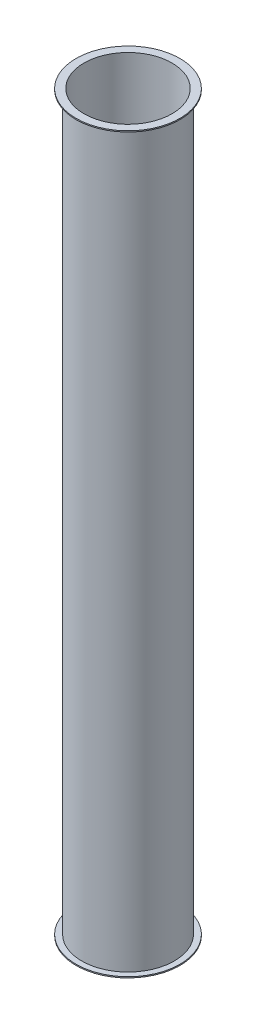
ISO-10303-21;
HEADER;
FILE_DESCRIPTION(('STEP AP214'),'2;1');
FILE_NAME('part.step','',(''),(''),'','','');
FILE_SCHEMA(('AUTOMOTIVE_DESIGN { 1 0 10303 214 1 1 1 1 }'));
ENDSEC;
DATA;
#1=APPLICATION_CONTEXT('core data for automotive mechanical design processes');
#2=APPLICATION_PROTOCOL_DEFINITION('international standard','automotive_design',2000,#1);
#3=PRODUCT_CONTEXT('',#1,'mechanical');
#4=PRODUCT('Part','Part','',(#3));
#5=PRODUCT_RELATED_PRODUCT_CATEGORY('part','',(#4));
#6=PRODUCT_DEFINITION_FORMATION('','',#4);
#7=PRODUCT_DEFINITION_CONTEXT('part definition',#1,'design');
#8=PRODUCT_DEFINITION('design','',#6,#7);
#9=PRODUCT_DEFINITION_SHAPE('','',#8);
#10=(LENGTH_UNIT() NAMED_UNIT(*) SI_UNIT(.MILLI.,.METRE.));
#11=(NAMED_UNIT(*) PLANE_ANGLE_UNIT() SI_UNIT($,.RADIAN.));
#12=(NAMED_UNIT(*) SI_UNIT($,.STERADIAN.) SOLID_ANGLE_UNIT());
#13=UNCERTAINTY_MEASURE_WITH_UNIT(LENGTH_MEASURE(1.E-05),#10,'distance_accuracy_value','');
#14=(GEOMETRIC_REPRESENTATION_CONTEXT(3) GLOBAL_UNCERTAINTY_ASSIGNED_CONTEXT((#13)) GLOBAL_UNIT_ASSIGNED_CONTEXT((#10,
#11,#12)) REPRESENTATION_CONTEXT('',''));
#15=CARTESIAN_POINT('',(0.,0.,0.));
#16=DIRECTION('',(0.,0.,1.));
#17=DIRECTION('',(1.,0.,0.));
#18=AXIS2_PLACEMENT_3D('',#15,#16,#17);
#19=CARTESIAN_POINT('',(0.,325.,0.));
#20=DIRECTION('',(0.,-1.,0.));
#21=DIRECTION('',(0.,0.,-1.));
#22=AXIS2_PLACEMENT_3D('',#19,#20,#21);
#23=CYLINDRICAL_SURFACE('',#22,41.);
#24=CARTESIAN_POINT('',(0.,324.,0.));
#25=DIRECTION('',(0.,1.,0.));
#26=DIRECTION('',(0.,0.,1.));
#27=AXIS2_PLACEMENT_3D('',#24,#25,#26);
#28=CIRCLE('',#27,41.);
#29=CARTESIAN_POINT('',(0.,324.,41.));
#30=VERTEX_POINT('',#29);
#31=EDGE_CURVE('E43',#30,#30,#28,.T.);
#32=ORIENTED_EDGE('',*,*,#31,.F.);
#33=EDGE_LOOP('',(#32));
#34=FACE_BOUND('',#33,.T.);
#35=CARTESIAN_POINT('',(0.,-324.,0.));
#36=DIRECTION('',(0.,-1.,0.));
#37=DIRECTION('',(0.,0.,-1.));
#38=AXIS2_PLACEMENT_3D('',#35,#36,#37);
#39=CIRCLE('',#38,41.);
#40=CARTESIAN_POINT('',(0.,-324.,-41.));
#41=VERTEX_POINT('',#40);
#42=EDGE_CURVE('E11',#41,#41,#39,.T.);
#43=ORIENTED_EDGE('',*,*,#42,.F.);
#44=EDGE_LOOP('',(#43));
#45=FACE_BOUND('',#44,.T.);
#46=ADVANCED_FACE('F37',(#34,#45),#23,.T.);
#47=CARTESIAN_POINT('',(0.,325.,0.));
#48=DIRECTION('',(0.,1.,0.));
#49=DIRECTION('',(0.,0.,1.));
#50=AXIS2_PLACEMENT_3D('',#47,#48,#49);
#51=PLANE('',#50);
#52=CARTESIAN_POINT('',(0.,325.,0.));
#53=DIRECTION('',(0.,1.,0.));
#54=DIRECTION('',(0.,0.,1.));
#55=AXIS2_PLACEMENT_3D('',#52,#53,#54);
#56=CIRCLE('',#55,39.);
#57=CARTESIAN_POINT('',(0.,325.,39.));
#58=VERTEX_POINT('',#57);
#59=EDGE_CURVE('E47',#58,#58,#56,.T.);
#60=ORIENTED_EDGE('',*,*,#59,.F.);
#61=EDGE_LOOP('',(#60));
#62=FACE_BOUND('',#61,.T.);
#63=CARTESIAN_POINT('',(0.,325.,0.));
#64=DIRECTION('',(0.,1.,0.));
#65=DIRECTION('',(0.,0.,1.));
#66=AXIS2_PLACEMENT_3D('',#63,#64,#65);
#67=CIRCLE('',#66,46.);
#68=CARTESIAN_POINT('',(0.,325.,46.));
#69=VERTEX_POINT('',#68);
#70=EDGE_CURVE('E57',#69,#69,#67,.T.);
#71=ORIENTED_EDGE('',*,*,#70,.T.);
#72=EDGE_LOOP('',(#71));
#73=FACE_BOUND('',#72,.T.);
#74=ADVANCED_FACE('F81',(#62,#73),#51,.T.);
#75=CARTESIAN_POINT('',(0.,-325.,0.));
#76=DIRECTION('',(0.,1.,0.));
#77=DIRECTION('',(0.,0.,1.));
#78=AXIS2_PLACEMENT_3D('',#75,#76,#77);
#79=PLANE('',#78);
#80=CARTESIAN_POINT('',(0.,-325.,0.));
#81=DIRECTION('',(0.,1.,0.));
#82=DIRECTION('',(0.,0.,1.));
#83=AXIS2_PLACEMENT_3D('',#80,#81,#82);
#84=CIRCLE('',#83,39.);
#85=CARTESIAN_POINT('',(0.,-325.,39.));
#86=VERTEX_POINT('',#85);
#87=EDGE_CURVE('E51',#86,#86,#84,.T.);
#88=ORIENTED_EDGE('',*,*,#87,.T.);
#89=EDGE_LOOP('',(#88));
#90=FACE_BOUND('',#89,.T.);
#91=CARTESIAN_POINT('',(0.,-325.,0.));
#92=DIRECTION('',(0.,-1.,0.));
#93=DIRECTION('',(0.,0.,-1.));
#94=AXIS2_PLACEMENT_3D('',#91,#92,#93);
#95=CIRCLE('',#94,46.);
#96=CARTESIAN_POINT('',(0.,-325.,-46.));
#97=VERTEX_POINT('',#96);
#98=EDGE_CURVE('E63',#97,#97,#95,.T.);
#99=ORIENTED_EDGE('',*,*,#98,.T.);
#100=EDGE_LOOP('',(#99));
#101=FACE_BOUND('',#100,.T.);
#102=ADVANCED_FACE('F86',(#90,#101),#79,.F.);
#103=CARTESIAN_POINT('',(0.,325.,0.));
#104=DIRECTION('',(0.,-1.,0.));
#105=DIRECTION('',(0.,0.,-1.));
#106=AXIS2_PLACEMENT_3D('',#103,#104,#105);
#107=CYLINDRICAL_SURFACE('',#106,39.);
#108=ORIENTED_EDGE('',*,*,#59,.T.);
#109=EDGE_LOOP('',(#108));
#110=FACE_BOUND('',#109,.T.);
#111=ORIENTED_EDGE('',*,*,#87,.F.);
#112=EDGE_LOOP('',(#111));
#113=FACE_BOUND('',#112,.T.);
#114=ADVANCED_FACE('F93',(#110,#113),#107,.F.);
#115=CARTESIAN_POINT('',(0.,324.,0.));
#116=DIRECTION('',(0.,1.,0.));
#117=DIRECTION('',(0.,0.,1.));
#118=AXIS2_PLACEMENT_3D('',#115,#116,#117);
#119=CYLINDRICAL_SURFACE('',#118,46.);
#120=CARTESIAN_POINT('',(0.,324.,0.));
#121=DIRECTION('',(0.,1.,0.));
#122=DIRECTION('',(0.,0.,1.));
#123=AXIS2_PLACEMENT_3D('',#120,#121,#122);
#124=CIRCLE('',#123,46.);
#125=CARTESIAN_POINT('',(0.,324.,46.));
#126=VERTEX_POINT('',#125);
#127=EDGE_CURVE('E55',#126,#126,#124,.T.);
#128=ORIENTED_EDGE('',*,*,#127,.T.);
#129=EDGE_LOOP('',(#128));
#130=FACE_BOUND('',#129,.T.);
#131=ORIENTED_EDGE('',*,*,#70,.F.);
#132=EDGE_LOOP('',(#131));
#133=FACE_BOUND('',#132,.T.);
#134=ADVANCED_FACE('F100',(#130,#133),#119,.T.);
#135=CARTESIAN_POINT('',(0.,324.,0.));
#136=DIRECTION('',(0.,1.,0.));
#137=DIRECTION('',(0.,0.,1.));
#138=AXIS2_PLACEMENT_3D('',#135,#136,#137);
#139=PLANE('',#138);
#140=ORIENTED_EDGE('',*,*,#31,.T.);
#141=EDGE_LOOP('',(#140));
#142=FACE_BOUND('',#141,.T.);
#143=ORIENTED_EDGE('',*,*,#127,.F.);
#144=EDGE_LOOP('',(#143));
#145=FACE_BOUND('',#144,.T.);
#146=ADVANCED_FACE('F78',(#142,#145),#139,.F.);
#147=CARTESIAN_POINT('',(0.,-324.,0.));
#148=DIRECTION('',(0.,-1.,0.));
#149=DIRECTION('',(0.,0.,-1.));
#150=AXIS2_PLACEMENT_3D('',#147,#148,#149);
#151=CYLINDRICAL_SURFACE('',#150,46.);
#152=CARTESIAN_POINT('',(0.,-324.,0.));
#153=DIRECTION('',(0.,-1.,0.));
#154=DIRECTION('',(0.,0.,-1.));
#155=AXIS2_PLACEMENT_3D('',#152,#153,#154);
#156=CIRCLE('',#155,46.);
#157=CARTESIAN_POINT('',(0.,-324.,-46.));
#158=VERTEX_POINT('',#157);
#159=EDGE_CURVE('E60',#158,#158,#156,.T.);
#160=ORIENTED_EDGE('',*,*,#159,.T.);
#161=EDGE_LOOP('',(#160));
#162=FACE_BOUND('',#161,.T.);
#163=ORIENTED_EDGE('',*,*,#98,.F.);
#164=EDGE_LOOP('',(#163));
#165=FACE_BOUND('',#164,.T.);
#166=ADVANCED_FACE('F69',(#162,#165),#151,.T.);
#167=CARTESIAN_POINT('',(0.,-324.,0.));
#168=DIRECTION('',(0.,-1.,0.));
#169=DIRECTION('',(0.,0.,-1.));
#170=AXIS2_PLACEMENT_3D('',#167,#168,#169);
#171=PLANE('',#170);
#172=ORIENTED_EDGE('',*,*,#42,.T.);
#173=EDGE_LOOP('',(#172));
#174=FACE_BOUND('',#173,.T.);
#175=ORIENTED_EDGE('',*,*,#159,.F.);
#176=EDGE_LOOP('',(#175));
#177=FACE_BOUND('',#176,.T.);
#178=ADVANCED_FACE('F72',(#174,#177),#171,.F.);
#179=CLOSED_SHELL('',(#46,#74,#102,#114,#134,#146,#166,#178));
#180=MANIFOLD_SOLID_BREP('B2',#179);
#181=ADVANCED_BREP_SHAPE_REPRESENTATION('',(#18,#180),#14);
#182=SHAPE_DEFINITION_REPRESENTATION(#9,#181);
ENDSEC;
END-ISO-10303-21;
